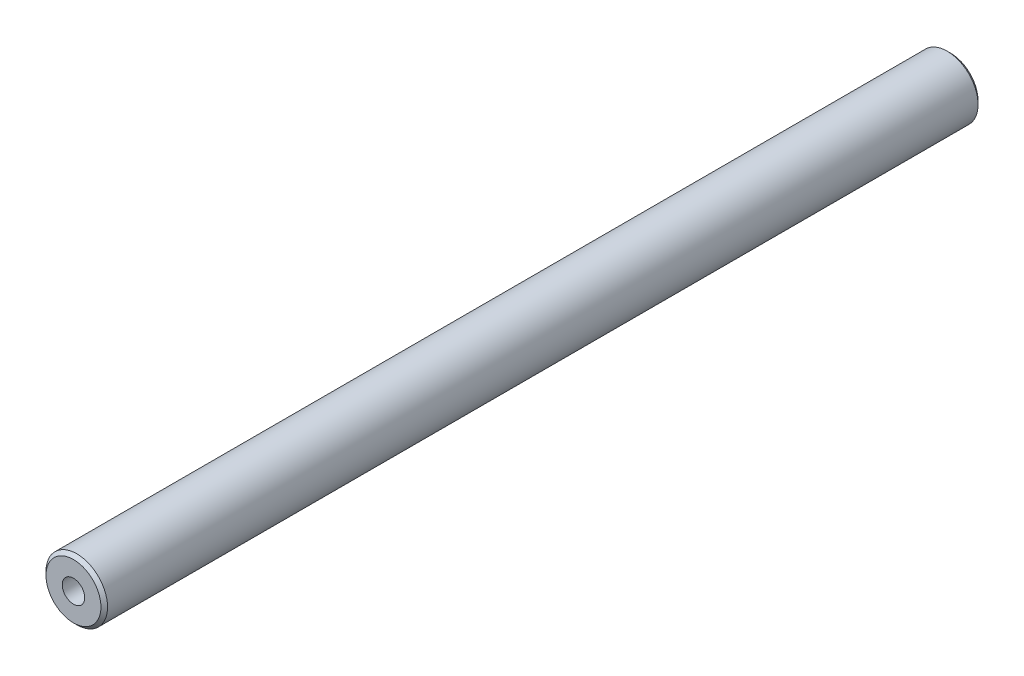
ISO-10303-21;
HEADER;
FILE_DESCRIPTION(('STEP AP214'),'2;1');
FILE_NAME('part.step','',(''),(''),'','','');
FILE_SCHEMA(('AUTOMOTIVE_DESIGN { 1 0 10303 214 1 1 1 1 }'));
ENDSEC;
DATA;
#1=APPLICATION_CONTEXT('core data for automotive mechanical design processes');
#2=APPLICATION_PROTOCOL_DEFINITION('international standard','automotive_design',2000,#1);
#3=PRODUCT_CONTEXT('',#1,'mechanical');
#4=PRODUCT('Part','Part','',(#3));
#5=PRODUCT_RELATED_PRODUCT_CATEGORY('part','',(#4));
#6=PRODUCT_DEFINITION_FORMATION('','',#4);
#7=PRODUCT_DEFINITION_CONTEXT('part definition',#1,'design');
#8=PRODUCT_DEFINITION('design','',#6,#7);
#9=PRODUCT_DEFINITION_SHAPE('','',#8);
#10=(LENGTH_UNIT() NAMED_UNIT(*) SI_UNIT(.MILLI.,.METRE.));
#11=(NAMED_UNIT(*) PLANE_ANGLE_UNIT() SI_UNIT($,.RADIAN.));
#12=(NAMED_UNIT(*) SI_UNIT($,.STERADIAN.) SOLID_ANGLE_UNIT());
#13=UNCERTAINTY_MEASURE_WITH_UNIT(LENGTH_MEASURE(1.E-05),#10,'distance_accuracy_value','');
#14=(GEOMETRIC_REPRESENTATION_CONTEXT(3) GLOBAL_UNCERTAINTY_ASSIGNED_CONTEXT((#13)) GLOBAL_UNIT_ASSIGNED_CONTEXT((#10,
#11,#12)) REPRESENTATION_CONTEXT('',''));
#15=CARTESIAN_POINT('',(0.,0.,0.));
#16=DIRECTION('',(0.,0.,1.));
#17=DIRECTION('',(1.,0.,0.));
#18=AXIS2_PLACEMENT_3D('',#15,#16,#17);
#19=CARTESIAN_POINT('',(0.,0.,0.));
#20=DIRECTION('',(0.,0.,1.));
#21=DIRECTION('',(1.,0.,0.));
#22=AXIS2_PLACEMENT_3D('',#19,#20,#21);
#23=PLANE('',#22);
#24=CARTESIAN_POINT('',(0.,0.,0.));
#25=DIRECTION('',(0.,0.,1.));
#26=DIRECTION('',(1.,0.,0.));
#27=AXIS2_PLACEMENT_3D('',#24,#25,#26);
#28=CIRCLE('',#27,1.72719999999999);
#29=CARTESIAN_POINT('',(1.72719999999999,0.,0.));
#30=VERTEX_POINT('',#29);
#31=EDGE_CURVE('E63',#30,#30,#28,.T.);
#32=ORIENTED_EDGE('',*,*,#31,.F.);
#33=EDGE_LOOP('',(#32));
#34=FACE_BOUND('',#33,.T.);
#35=CARTESIAN_POINT('',(0.,0.,0.));
#36=DIRECTION('',(0.,0.,1.));
#37=DIRECTION('',(1.,0.,0.));
#38=AXIS2_PLACEMENT_3D('',#35,#36,#37);
#39=CIRCLE('',#38,4.22275000000003);
#40=CARTESIAN_POINT('',(4.22275000000003,0.,0.));
#41=VERTEX_POINT('',#40);
#42=EDGE_CURVE('E11',#41,#41,#39,.T.);
#43=ORIENTED_EDGE('',*,*,#42,.T.);
#44=EDGE_LOOP('',(#43));
#45=FACE_BOUND('',#44,.T.);
#46=ADVANCED_FACE('F39',(#34,#45),#23,.T.);
#47=CARTESIAN_POINT('',(0.,0.,0.));
#48=DIRECTION('',(0.,0.,-1.));
#49=DIRECTION('',(-1.,0.,0.));
#50=AXIS2_PLACEMENT_3D('',#47,#48,#49);
#51=CYLINDRICAL_SURFACE('',#50,4.73075);
#52=CARTESIAN_POINT('',(0.,0.,-134.314282189589));
#53=DIRECTION('',(0.,0.,-1.));
#54=DIRECTION('',(-1.,0.,0.));
#55=AXIS2_PLACEMENT_3D('',#52,#53,#54);
#56=CIRCLE('',#55,4.73075);
#57=CARTESIAN_POINT('',(-4.73075,0.,-134.314282189589));
#58=VERTEX_POINT('',#57);
#59=EDGE_CURVE('E47',#58,#58,#56,.F.);
#60=ORIENTED_EDGE('',*,*,#59,.T.);
#61=EDGE_LOOP('',(#60));
#62=FACE_BOUND('',#61,.T.);
#63=CARTESIAN_POINT('',(0.,0.,-0.507999999999972));
#64=DIRECTION('',(0.,0.,1.));
#65=DIRECTION('',(1.,0.,0.));
#66=AXIS2_PLACEMENT_3D('',#63,#64,#65);
#67=CIRCLE('',#66,4.73075);
#68=CARTESIAN_POINT('',(4.73075,0.,-0.507999999999972));
#69=VERTEX_POINT('',#68);
#70=EDGE_CURVE('E77',#69,#69,#67,.F.);
#71=ORIENTED_EDGE('',*,*,#70,.T.);
#72=EDGE_LOOP('',(#71));
#73=FACE_BOUND('',#72,.T.);
#74=ADVANCED_FACE('F82',(#62,#73),#51,.T.);
#75=CARTESIAN_POINT('',(0.,0.,-134.822282189589));
#76=DIRECTION('',(0.,0.,-1.));
#77=DIRECTION('',(-1.,0.,0.));
#78=AXIS2_PLACEMENT_3D('',#75,#76,#77);
#79=PLANE('',#78);
#80=CARTESIAN_POINT('',(0.,0.,-134.822282189589));
#81=DIRECTION('',(0.,0.,-1.));
#82=DIRECTION('',(-1.,0.,0.));
#83=AXIS2_PLACEMENT_3D('',#80,#81,#82);
#84=CIRCLE('',#83,1.7272);
#85=CARTESIAN_POINT('',(-1.7272,0.,-134.822282189589));
#86=VERTEX_POINT('',#85);
#87=EDGE_CURVE('E64',#86,#86,#84,.T.);
#88=ORIENTED_EDGE('',*,*,#87,.F.);
#89=EDGE_LOOP('',(#88));
#90=FACE_BOUND('',#89,.T.);
#91=CARTESIAN_POINT('',(0.,0.,-134.822282189589));
#92=DIRECTION('',(0.,0.,-1.));
#93=DIRECTION('',(-1.,0.,0.));
#94=AXIS2_PLACEMENT_3D('',#91,#92,#93);
#95=CIRCLE('',#94,4.22274999999998);
#96=CARTESIAN_POINT('',(-4.22274999999998,0.,-134.822282189589));
#97=VERTEX_POINT('',#96);
#98=EDGE_CURVE('E74',#97,#97,#95,.T.);
#99=ORIENTED_EDGE('',*,*,#98,.T.);
#100=EDGE_LOOP('',(#99));
#101=FACE_BOUND('',#100,.T.);
#102=ADVANCED_FACE('F88',(#90,#101),#79,.T.);
#103=CARTESIAN_POINT('',(0.,0.,-134.822282189589));
#104=DIRECTION('',(0.,0.,1.));
#105=DIRECTION('',(1.,0.,0.));
#106=AXIS2_PLACEMENT_3D('',#103,#104,#105);
#107=CONICAL_SURFACE('',#106,4.22274999999998,0.785398163397456);
#108=ORIENTED_EDGE('',*,*,#59,.F.);
#109=EDGE_LOOP('',(#108));
#110=FACE_BOUND('',#109,.T.);
#111=ORIENTED_EDGE('',*,*,#98,.F.);
#112=EDGE_LOOP('',(#111));
#113=FACE_BOUND('',#112,.T.);
#114=ADVANCED_FACE('F85',(#110,#113),#107,.T.);
#115=CARTESIAN_POINT('',(0.,0.,-0.507999999999972));
#116=DIRECTION('',(0.,0.,-1.));
#117=DIRECTION('',(-1.,0.,0.));
#118=AXIS2_PLACEMENT_3D('',#115,#116,#117);
#119=CONICAL_SURFACE('',#118,4.73075,0.785398163397451);
#120=ORIENTED_EDGE('',*,*,#42,.F.);
#121=EDGE_LOOP('',(#120));
#122=FACE_BOUND('',#121,.T.);
#123=ORIENTED_EDGE('',*,*,#70,.F.);
#124=EDGE_LOOP('',(#123));
#125=FACE_BOUND('',#124,.T.);
#126=ADVANCED_FACE('F41',(#122,#125),#119,.T.);
#127=CARTESIAN_POINT('',(0.,0.,-10.7188));
#128=DIRECTION('',(0.,0.,1.));
#129=DIRECTION('',(1.,0.,0.));
#130=AXIS2_PLACEMENT_3D('',#127,#128,#129);
#131=CONICAL_SURFACE('',#130,1.72719999999999,1.02974425867665);
#132=CARTESIAN_POINT('',(0.,0.,-11.7566064611844));
#133=VERTEX_POINT('',#132);
#134=VERTEX_LOOP('',#133);
#135=FACE_BOUND('',#134,.T.);
#136=CARTESIAN_POINT('',(0.,0.,-10.7188));
#137=DIRECTION('',(0.,0.,1.));
#138=DIRECTION('',(1.,0.,0.));
#139=AXIS2_PLACEMENT_3D('',#136,#137,#138);
#140=CIRCLE('',#139,1.72719999999999);
#141=CARTESIAN_POINT('',(1.72719999999999,0.,-10.7188));
#142=VERTEX_POINT('',#141);
#143=EDGE_CURVE('E67',#142,#142,#140,.T.);
#144=ORIENTED_EDGE('',*,*,#143,.T.);
#145=EDGE_LOOP('',(#144));
#146=FACE_BOUND('',#145,.T.);
#147=ADVANCED_FACE('F111',(#135,#146),#131,.F.);
#148=CARTESIAN_POINT('',(0.,0.,0.));
#149=DIRECTION('',(0.,0.,1.));
#150=DIRECTION('',(1.,0.,0.));
#151=AXIS2_PLACEMENT_3D('',#148,#149,#150);
#152=CYLINDRICAL_SURFACE('',#151,1.72719999999999);
#153=ORIENTED_EDGE('',*,*,#143,.F.);
#154=EDGE_LOOP('',(#153));
#155=FACE_BOUND('',#154,.T.);
#156=ORIENTED_EDGE('',*,*,#31,.T.);
#157=EDGE_LOOP('',(#156));
#158=FACE_BOUND('',#157,.T.);
#159=ADVANCED_FACE('F57',(#155,#158),#152,.F.);
#160=CARTESIAN_POINT('',(0.,0.,-124.103482189589));
#161=DIRECTION('',(0.,0.,-1.));
#162=DIRECTION('',(-1.,0.,0.));
#163=AXIS2_PLACEMENT_3D('',#160,#161,#162);
#164=CONICAL_SURFACE('',#163,1.7272,1.02974425867665);
#165=CARTESIAN_POINT('',(0.,0.,-123.065675728404));
#166=VERTEX_POINT('',#165);
#167=VERTEX_LOOP('',#166);
#168=FACE_BOUND('',#167,.T.);
#169=CARTESIAN_POINT('',(0.,0.,-124.103482189589));
#170=DIRECTION('',(0.,0.,-1.));
#171=DIRECTION('',(-1.,0.,0.));
#172=AXIS2_PLACEMENT_3D('',#169,#170,#171);
#173=CIRCLE('',#172,1.7272);
#174=CARTESIAN_POINT('',(-1.7272,0.,-124.103482189589));
#175=VERTEX_POINT('',#174);
#176=EDGE_CURVE('E61',#175,#175,#173,.T.);
#177=ORIENTED_EDGE('',*,*,#176,.T.);
#178=EDGE_LOOP('',(#177));
#179=FACE_BOUND('',#178,.T.);
#180=ADVANCED_FACE('F53',(#168,#179),#164,.F.);
#181=CARTESIAN_POINT('',(0.,0.,-134.822282189589));
#182=DIRECTION('',(0.,0.,-1.));
#183=DIRECTION('',(-1.,0.,0.));
#184=AXIS2_PLACEMENT_3D('',#181,#182,#183);
#185=CYLINDRICAL_SURFACE('',#184,1.7272);
#186=ORIENTED_EDGE('',*,*,#176,.F.);
#187=EDGE_LOOP('',(#186));
#188=FACE_BOUND('',#187,.T.);
#189=ORIENTED_EDGE('',*,*,#87,.T.);
#190=EDGE_LOOP('',(#189));
#191=FACE_BOUND('',#190,.T.);
#192=ADVANCED_FACE('F56',(#188,#191),#185,.F.);
#193=CLOSED_SHELL('',(#46,#74,#102,#114,#126,#147,#159,#180,#192));
#194=MANIFOLD_SOLID_BREP('B2',#193);
#195=ADVANCED_BREP_SHAPE_REPRESENTATION('',(#18,#194),#14);
#196=SHAPE_DEFINITION_REPRESENTATION(#9,#195);
ENDSEC;
END-ISO-10303-21;
